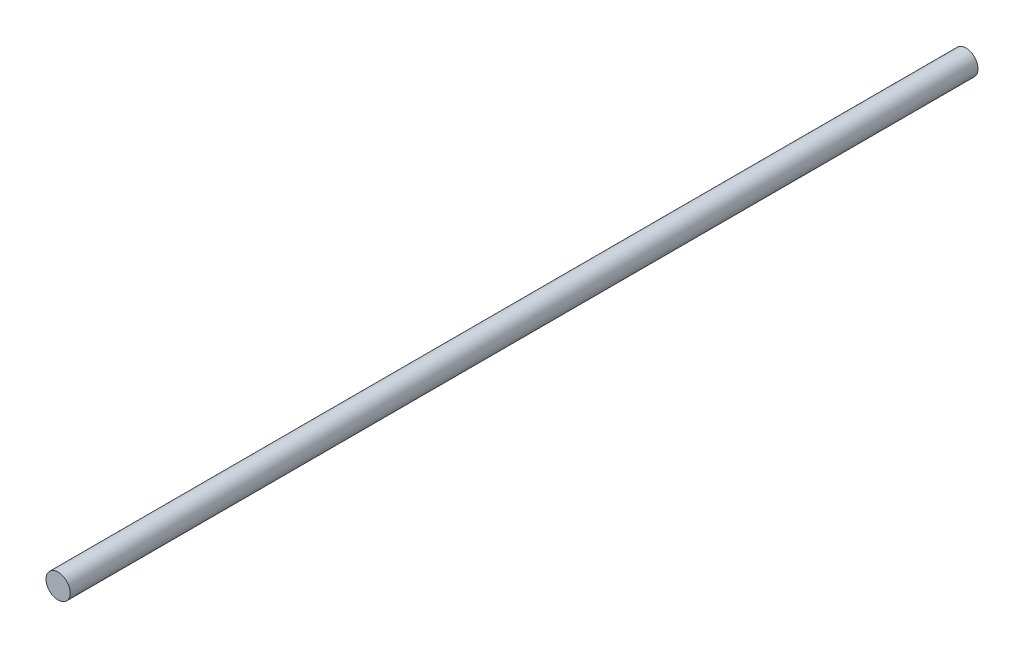
ISO-10303-21;
HEADER;
FILE_DESCRIPTION(('STEP AP214'),'2;1');
FILE_NAME('part.step','',(''),(''),'','','');
FILE_SCHEMA(('AUTOMOTIVE_DESIGN { 1 0 10303 214 1 1 1 1 }'));
ENDSEC;
DATA;
#1=APPLICATION_CONTEXT('core data for automotive mechanical design processes');
#2=APPLICATION_PROTOCOL_DEFINITION('international standard','automotive_design',2000,#1);
#3=PRODUCT_CONTEXT('',#1,'mechanical');
#4=PRODUCT('Part','Part','',(#3));
#5=PRODUCT_RELATED_PRODUCT_CATEGORY('part','',(#4));
#6=PRODUCT_DEFINITION_FORMATION('','',#4);
#7=PRODUCT_DEFINITION_CONTEXT('part definition',#1,'design');
#8=PRODUCT_DEFINITION('design','',#6,#7);
#9=PRODUCT_DEFINITION_SHAPE('','',#8);
#10=(LENGTH_UNIT() NAMED_UNIT(*) SI_UNIT(.MILLI.,.METRE.));
#11=(NAMED_UNIT(*) PLANE_ANGLE_UNIT() SI_UNIT($,.RADIAN.));
#12=(NAMED_UNIT(*) SI_UNIT($,.STERADIAN.) SOLID_ANGLE_UNIT());
#13=UNCERTAINTY_MEASURE_WITH_UNIT(LENGTH_MEASURE(1.E-05),#10,'distance_accuracy_value','');
#14=(GEOMETRIC_REPRESENTATION_CONTEXT(3) GLOBAL_UNCERTAINTY_ASSIGNED_CONTEXT((#13)) GLOBAL_UNIT_ASSIGNED_CONTEXT((#10,
#11,#12)) REPRESENTATION_CONTEXT('',''));
#15=CARTESIAN_POINT('',(0.,0.,0.));
#16=DIRECTION('',(0.,0.,1.));
#17=DIRECTION('',(1.,0.,0.));
#18=AXIS2_PLACEMENT_3D('',#15,#16,#17);
#19=CARTESIAN_POINT('',(0.,0.,1219.2));
#20=DIRECTION('',(0.,0.,-1.));
#21=DIRECTION('',(-1.,0.,0.));
#22=AXIS2_PLACEMENT_3D('',#19,#20,#21);
#23=CYLINDRICAL_SURFACE('',#22,16.25);
#24=CARTESIAN_POINT('',(0.,0.,1219.2));
#25=DIRECTION('',(0.,0.,1.));
#26=DIRECTION('',(1.,0.,0.));
#27=AXIS2_PLACEMENT_3D('',#24,#25,#26);
#28=CIRCLE('',#27,16.25);
#29=CARTESIAN_POINT('',(-16.25,0.,1219.2));
#30=VERTEX_POINT('',#29);
#31=EDGE_CURVE('E10',#30,#30,#28,.T.);
#32=CARTESIAN_POINT('',(0.,0.,0.));
#33=DIRECTION('',(0.,0.,1.));
#34=DIRECTION('',(1.,0.,0.));
#35=AXIS2_PLACEMENT_3D('',#32,#33,#34);
#36=CIRCLE('',#35,16.25);
#37=CARTESIAN_POINT('',(-16.25,0.,0.));
#38=VERTEX_POINT('',#37);
#39=EDGE_CURVE('E34',#38,#38,#36,.T.);
#40=CARTESIAN_POINT('',(-16.25,0.,1219.2));
#41=CARTESIAN_POINT('',(-16.25,0.,1206.5));
#42=CARTESIAN_POINT('',(-16.25,0.,1193.8));
#43=CARTESIAN_POINT('',(-16.25,0.,1168.4));
#44=CARTESIAN_POINT('',(-16.25,0.,1155.7));
#45=CARTESIAN_POINT('',(-16.25,0.,1130.3));
#46=CARTESIAN_POINT('',(-16.25,0.,1117.6));
#47=CARTESIAN_POINT('',(-16.25,0.,1092.2));
#48=CARTESIAN_POINT('',(-16.25,0.,1079.5));
#49=CARTESIAN_POINT('',(-16.25,0.,1054.1));
#50=CARTESIAN_POINT('',(-16.25,0.,1041.4));
#51=CARTESIAN_POINT('',(-16.25,0.,1016.));
#52=CARTESIAN_POINT('',(-16.25,0.,1003.3));
#53=CARTESIAN_POINT('',(-16.25,0.,977.9));
#54=CARTESIAN_POINT('',(-16.25,0.,965.2));
#55=CARTESIAN_POINT('',(-16.25,0.,939.8));
#56=CARTESIAN_POINT('',(-16.25,0.,927.1));
#57=CARTESIAN_POINT('',(-16.25,0.,901.7));
#58=CARTESIAN_POINT('',(-16.25,0.,889.));
#59=CARTESIAN_POINT('',(-16.25,0.,863.6));
#60=CARTESIAN_POINT('',(-16.25,0.,850.9));
#61=CARTESIAN_POINT('',(-16.25,0.,825.5));
#62=CARTESIAN_POINT('',(-16.25,0.,812.8));
#63=CARTESIAN_POINT('',(-16.25,0.,787.4));
#64=CARTESIAN_POINT('',(-16.25,0.,774.7));
#65=CARTESIAN_POINT('',(-16.25,0.,749.3));
#66=CARTESIAN_POINT('',(-16.25,0.,736.6));
#67=CARTESIAN_POINT('',(-16.25,0.,711.2));
#68=CARTESIAN_POINT('',(-16.25,0.,698.5));
#69=CARTESIAN_POINT('',(-16.25,0.,673.1));
#70=CARTESIAN_POINT('',(-16.25,0.,660.4));
#71=CARTESIAN_POINT('',(-16.25,0.,635.));
#72=CARTESIAN_POINT('',(-16.25,0.,622.3));
#73=CARTESIAN_POINT('',(-16.25,0.,596.9));
#74=CARTESIAN_POINT('',(-16.25,0.,584.2));
#75=CARTESIAN_POINT('',(-16.25,0.,558.8));
#76=CARTESIAN_POINT('',(-16.25,0.,546.1));
#77=CARTESIAN_POINT('',(-16.25,0.,520.7));
#78=CARTESIAN_POINT('',(-16.25,0.,508.));
#79=CARTESIAN_POINT('',(-16.25,0.,482.6));
#80=CARTESIAN_POINT('',(-16.25,0.,469.9));
#81=CARTESIAN_POINT('',(-16.25,0.,444.5));
#82=CARTESIAN_POINT('',(-16.25,0.,431.8));
#83=CARTESIAN_POINT('',(-16.25,0.,406.4));
#84=CARTESIAN_POINT('',(-16.25,0.,393.7));
#85=CARTESIAN_POINT('',(-16.25,0.,368.3));
#86=CARTESIAN_POINT('',(-16.25,0.,355.6));
#87=CARTESIAN_POINT('',(-16.25,0.,330.2));
#88=CARTESIAN_POINT('',(-16.25,0.,317.5));
#89=CARTESIAN_POINT('',(-16.25,0.,292.1));
#90=CARTESIAN_POINT('',(-16.25,0.,279.4));
#91=CARTESIAN_POINT('',(-16.25,0.,254.));
#92=CARTESIAN_POINT('',(-16.25,0.,241.3));
#93=CARTESIAN_POINT('',(-16.25,0.,215.9));
#94=CARTESIAN_POINT('',(-16.25,0.,203.2));
#95=CARTESIAN_POINT('',(-16.25,0.,177.8));
#96=CARTESIAN_POINT('',(-16.25,0.,165.1));
#97=CARTESIAN_POINT('',(-16.25,0.,139.7));
#98=CARTESIAN_POINT('',(-16.25,0.,127.));
#99=CARTESIAN_POINT('',(-16.25,0.,101.6));
#100=CARTESIAN_POINT('',(-16.25,0.,88.9));
#101=CARTESIAN_POINT('',(-16.25,0.,63.5));
#102=CARTESIAN_POINT('',(-16.25,0.,50.8));
#103=CARTESIAN_POINT('',(-16.25,0.,25.4));
#104=CARTESIAN_POINT('',(-16.25,0.,12.7));
#105=CARTESIAN_POINT('',(-16.25,0.,0.));
#106=B_SPLINE_CURVE_WITH_KNOTS('',3,(#40,#41,#42,#43,#44,#45,#46,#47,#48,#49,#50,#51,#52,#53,
#54,#55,#56,#57,#58,#59,#60,#61,#62,#63,#64,#65,#66,#67,#68,#69,#70,#71,#72,#73,#74,#75,#76,#77,
#78,#79,#80,#81,#82,#83,#84,#85,#86,#87,#88,#89,#90,#91,#92,#93,#94,#95,#96,#97,#98,#99,#100,
#101,#102,#103,#104,#105),.UNSPECIFIED.,.F.,.F.,(4,2,2,2,2,2,2,2,2,2,2,2,2,2,2,2,2,2,2,2,2,2,2,
2,2,2,2,2,2,2,2,2,4),(0.,38.1,76.2,114.3,152.4,190.5,228.6,266.7,304.8,342.9,381.,419.1,457.2,
495.3,533.4,571.5,609.6,647.7,685.8,723.9,762.,800.1,838.2,876.3,914.4,952.5,990.6,1028.7,
1066.8,1104.9,1143.,1181.1,1219.2),.UNSPECIFIED.);
#107=EDGE_CURVE('BSEAM31',#30,#38,#106,.T.);
#108=ORIENTED_EDGE('',*,*,#31,.F.);
#109=ORIENTED_EDGE('',*,*,#39,.T.);
#110=ORIENTED_EDGE('',*,*,#107,.T.);
#111=ORIENTED_EDGE('',*,*,#107,.F.);
#112=EDGE_LOOP('',(#108,#110,#109,#111));
#113=FACE_BOUND('',#112,.T.);
#114=ADVANCED_FACE('F31',(#113),#23,.T.);
#115=CARTESIAN_POINT('',(0.,0.,1219.2));
#116=DIRECTION('',(0.,0.,1.));
#117=DIRECTION('',(1.,0.,0.));
#118=AXIS2_PLACEMENT_3D('',#115,#116,#117);
#119=PLANE('',#118);
#120=ORIENTED_EDGE('',*,*,#31,.T.);
#121=EDGE_LOOP('',(#120));
#122=FACE_BOUND('',#121,.T.);
#123=ADVANCED_FACE('F46',(#122),#119,.T.);
#124=CARTESIAN_POINT('',(0.,0.,0.));
#125=DIRECTION('',(0.,0.,1.));
#126=DIRECTION('',(1.,0.,0.));
#127=AXIS2_PLACEMENT_3D('',#124,#125,#126);
#128=PLANE('',#127);
#129=ORIENTED_EDGE('',*,*,#39,.F.);
#130=EDGE_LOOP('',(#129));
#131=FACE_BOUND('',#130,.T.);
#132=ADVANCED_FACE('F44',(#131),#128,.F.);
#133=CLOSED_SHELL('',(#114,#123,#132));
#134=MANIFOLD_SOLID_BREP('B2',#133);
#135=ADVANCED_BREP_SHAPE_REPRESENTATION('',(#18,#134),#14);
#136=SHAPE_DEFINITION_REPRESENTATION(#9,#135);
ENDSEC;
END-ISO-10303-21;
